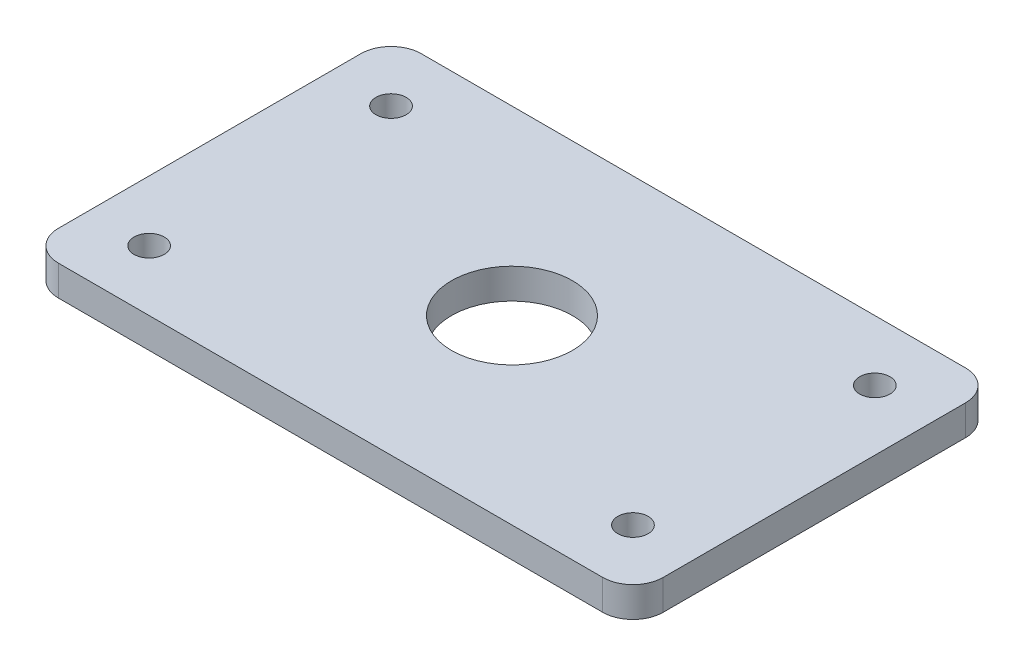
ISO-10303-21;
HEADER;
FILE_DESCRIPTION(('STEP AP214'),'2;1');
FILE_NAME('part.step','',(''),(''),'','','');
FILE_SCHEMA(('AUTOMOTIVE_DESIGN { 1 0 10303 214 1 1 1 1 }'));
ENDSEC;
DATA;
#1=APPLICATION_CONTEXT('core data for automotive mechanical design processes');
#2=APPLICATION_PROTOCOL_DEFINITION('international standard','automotive_design',2000,#1);
#3=PRODUCT_CONTEXT('',#1,'mechanical');
#4=PRODUCT('Part','Part','',(#3));
#5=PRODUCT_RELATED_PRODUCT_CATEGORY('part','',(#4));
#6=PRODUCT_DEFINITION_FORMATION('','',#4);
#7=PRODUCT_DEFINITION_CONTEXT('part definition',#1,'design');
#8=PRODUCT_DEFINITION('design','',#6,#7);
#9=PRODUCT_DEFINITION_SHAPE('','',#8);
#10=(LENGTH_UNIT() NAMED_UNIT(*) SI_UNIT(.MILLI.,.METRE.));
#11=(NAMED_UNIT(*) PLANE_ANGLE_UNIT() SI_UNIT($,.RADIAN.));
#12=(NAMED_UNIT(*) SI_UNIT($,.STERADIAN.) SOLID_ANGLE_UNIT());
#13=UNCERTAINTY_MEASURE_WITH_UNIT(LENGTH_MEASURE(1.E-05),#10,'distance_accuracy_value','');
#14=(GEOMETRIC_REPRESENTATION_CONTEXT(3) GLOBAL_UNCERTAINTY_ASSIGNED_CONTEXT((#13)) GLOBAL_UNIT_ASSIGNED_CONTEXT((#10,
#11,#12)) REPRESENTATION_CONTEXT('',''));
#15=CARTESIAN_POINT('',(0.,0.,0.));
#16=DIRECTION('',(0.,0.,1.));
#17=DIRECTION('',(1.,0.,0.));
#18=AXIS2_PLACEMENT_3D('',#15,#16,#17);
#19=CARTESIAN_POINT('',(-50.8,0.,25.4));
#20=DIRECTION('',(0.,1.,0.));
#21=DIRECTION('',(0.,0.,1.));
#22=AXIS2_PLACEMENT_3D('',#19,#20,#21);
#23=CYLINDRICAL_SURFACE('',#22,3.175);
#24=CARTESIAN_POINT('',(-50.8,0.,25.4));
#25=DIRECTION('',(0.,1.,0.));
#26=DIRECTION('',(0.,0.,1.));
#27=AXIS2_PLACEMENT_3D('',#24,#25,#26);
#28=CIRCLE('',#27,3.175);
#29=CARTESIAN_POINT('',(-50.8,0.,28.575));
#30=VERTEX_POINT('',#29);
#31=EDGE_CURVE('E148',#30,#30,#28,.T.);
#32=ORIENTED_EDGE('',*,*,#31,.F.);
#33=EDGE_LOOP('',(#32));
#34=FACE_BOUND('',#33,.T.);
#35=CARTESIAN_POINT('',(-50.8,6.35,25.4));
#36=DIRECTION('',(0.,1.,0.));
#37=DIRECTION('',(0.,0.,1.));
#38=AXIS2_PLACEMENT_3D('',#35,#36,#37);
#39=CIRCLE('',#38,3.175);
#40=CARTESIAN_POINT('',(-50.8,6.35,28.575));
#41=VERTEX_POINT('',#40);
#42=EDGE_CURVE('E153',#41,#41,#39,.T.);
#43=ORIENTED_EDGE('',*,*,#42,.T.);
#44=EDGE_LOOP('',(#43));
#45=FACE_BOUND('',#44,.T.);
#46=ADVANCED_FACE('F41',(#34,#45),#23,.F.);
#47=CARTESIAN_POINT('',(50.8,0.,25.4));
#48=DIRECTION('',(0.,1.,0.));
#49=DIRECTION('',(0.,0.,1.));
#50=AXIS2_PLACEMENT_3D('',#47,#48,#49);
#51=CYLINDRICAL_SURFACE('',#50,3.175);
#52=CARTESIAN_POINT('',(50.8,0.,25.4));
#53=DIRECTION('',(0.,1.,0.));
#54=DIRECTION('',(0.,0.,1.));
#55=AXIS2_PLACEMENT_3D('',#52,#53,#54);
#56=CIRCLE('',#55,3.175);
#57=CARTESIAN_POINT('',(50.8,0.,28.575));
#58=VERTEX_POINT('',#57);
#59=EDGE_CURVE('E141',#58,#58,#56,.T.);
#60=ORIENTED_EDGE('',*,*,#59,.F.);
#61=EDGE_LOOP('',(#60));
#62=FACE_BOUND('',#61,.T.);
#63=CARTESIAN_POINT('',(50.8,6.35,25.4));
#64=DIRECTION('',(0.,1.,0.));
#65=DIRECTION('',(0.,0.,1.));
#66=AXIS2_PLACEMENT_3D('',#63,#64,#65);
#67=CIRCLE('',#66,3.175);
#68=CARTESIAN_POINT('',(50.8,6.35,28.575));
#69=VERTEX_POINT('',#68);
#70=EDGE_CURVE('E147',#69,#69,#67,.T.);
#71=ORIENTED_EDGE('',*,*,#70,.T.);
#72=EDGE_LOOP('',(#71));
#73=FACE_BOUND('',#72,.T.);
#74=ADVANCED_FACE('F250',(#62,#73),#51,.F.);
#75=CARTESIAN_POINT('',(-63.5,6.35,38.1));
#76=DIRECTION('',(1.,0.,0.));
#77=DIRECTION('',(0.,0.,-1.));
#78=AXIS2_PLACEMENT_3D('',#75,#76,#77);
#79=PLANE('',#78);
#80=DIRECTION('',(0.,0.,1.));
#81=VECTOR('',#80,1.);
#82=CARTESIAN_POINT('',(-63.5,6.35,38.1));
#83=LINE('',#82,#81);
#84=CARTESIAN_POINT('',(-63.5,6.35,-31.75));
#85=VERTEX_POINT('',#84);
#86=CARTESIAN_POINT('',(-63.5,6.35,31.75));
#87=VERTEX_POINT('',#86);
#88=EDGE_CURVE('E136',#85,#87,#83,.T.);
#89=ORIENTED_EDGE('',*,*,#88,.F.);
#90=DIRECTION('',(0.,-1.,0.));
#91=VECTOR('',#90,1.);
#92=CARTESIAN_POINT('',(-63.5,6.35,-31.75));
#93=LINE('',#92,#91);
#94=CARTESIAN_POINT('',(-63.5,0.,-31.75));
#95=VERTEX_POINT('',#94);
#96=EDGE_CURVE('E11',#85,#95,#93,.T.);
#97=ORIENTED_EDGE('',*,*,#96,.T.);
#98=DIRECTION('',(0.,0.,1.));
#99=VECTOR('',#98,1.);
#100=CARTESIAN_POINT('',(-63.5,0.,38.1));
#101=LINE('',#100,#99);
#102=CARTESIAN_POINT('',(-63.5,0.,31.75));
#103=VERTEX_POINT('',#102);
#104=EDGE_CURVE('E138',#95,#103,#101,.T.);
#105=ORIENTED_EDGE('',*,*,#104,.T.);
#106=DIRECTION('',(0.,-1.,0.));
#107=VECTOR('',#106,1.);
#108=CARTESIAN_POINT('',(-63.5,6.35,31.75));
#109=LINE('',#108,#107);
#110=EDGE_CURVE('E47',#103,#87,#109,.F.);
#111=ORIENTED_EDGE('',*,*,#110,.T.);
#112=EDGE_LOOP('',(#89,#97,#105,#111));
#113=FACE_BOUND('',#112,.T.);
#114=ADVANCED_FACE('F177',(#113),#79,.F.);
#115=CARTESIAN_POINT('',(63.5,6.35,38.1));
#116=DIRECTION('',(0.,0.,-1.));
#117=DIRECTION('',(-1.,0.,0.));
#118=AXIS2_PLACEMENT_3D('',#115,#116,#117);
#119=PLANE('',#118);
#120=DIRECTION('',(1.,0.,0.));
#121=VECTOR('',#120,1.);
#122=CARTESIAN_POINT('',(63.5,0.,38.1));
#123=LINE('',#122,#121);
#124=CARTESIAN_POINT('',(-57.15,0.,38.1));
#125=VERTEX_POINT('',#124);
#126=CARTESIAN_POINT('',(57.15,0.,38.1));
#127=VERTEX_POINT('',#126);
#128=EDGE_CURVE('E134',#125,#127,#123,.T.);
#129=ORIENTED_EDGE('',*,*,#128,.T.);
#130=DIRECTION('',(0.,-1.,0.));
#131=VECTOR('',#130,1.);
#132=CARTESIAN_POINT('',(57.15,6.35,38.1));
#133=LINE('',#132,#131);
#134=CARTESIAN_POINT('',(57.15,6.35,38.1));
#135=VERTEX_POINT('',#134);
#136=EDGE_CURVE('E113',#127,#135,#133,.F.);
#137=ORIENTED_EDGE('',*,*,#136,.T.);
#138=DIRECTION('',(1.,0.,0.));
#139=VECTOR('',#138,1.);
#140=CARTESIAN_POINT('',(63.5,6.35,38.1));
#141=LINE('',#140,#139);
#142=CARTESIAN_POINT('',(-57.15,6.35,38.1));
#143=VERTEX_POINT('',#142);
#144=EDGE_CURVE('E186',#143,#135,#141,.T.);
#145=ORIENTED_EDGE('',*,*,#144,.F.);
#146=DIRECTION('',(0.,-1.,0.));
#147=VECTOR('',#146,1.);
#148=CARTESIAN_POINT('',(-57.15,6.35,38.1));
#149=LINE('',#148,#147);
#150=EDGE_CURVE('E117',#143,#125,#149,.T.);
#151=ORIENTED_EDGE('',*,*,#150,.T.);
#152=EDGE_LOOP('',(#129,#137,#145,#151));
#153=FACE_BOUND('',#152,.T.);
#154=ADVANCED_FACE('F194',(#153),#119,.F.);
#155=CARTESIAN_POINT('',(63.5,6.35,38.1));
#156=DIRECTION('',(-1.,0.,0.));
#157=DIRECTION('',(0.,0.,1.));
#158=AXIS2_PLACEMENT_3D('',#155,#156,#157);
#159=PLANE('',#158);
#160=DIRECTION('',(0.,0.,-1.));
#161=VECTOR('',#160,1.);
#162=CARTESIAN_POINT('',(63.5,6.35,38.1));
#163=LINE('',#162,#161);
#164=CARTESIAN_POINT('',(63.5,6.35,31.75));
#165=VERTEX_POINT('',#164);
#166=CARTESIAN_POINT('',(63.5,6.35,-31.75));
#167=VERTEX_POINT('',#166);
#168=EDGE_CURVE('E130',#165,#167,#163,.T.);
#169=ORIENTED_EDGE('',*,*,#168,.F.);
#170=DIRECTION('',(0.,-1.,0.));
#171=VECTOR('',#170,1.);
#172=CARTESIAN_POINT('',(63.5,6.35,31.75));
#173=LINE('',#172,#171);
#174=CARTESIAN_POINT('',(63.5,0.,31.75));
#175=VERTEX_POINT('',#174);
#176=EDGE_CURVE('E115',#165,#175,#173,.T.);
#177=ORIENTED_EDGE('',*,*,#176,.T.);
#178=DIRECTION('',(0.,0.,-1.));
#179=VECTOR('',#178,1.);
#180=CARTESIAN_POINT('',(63.5,0.,38.1));
#181=LINE('',#180,#179);
#182=CARTESIAN_POINT('',(63.5,0.,-31.75));
#183=VERTEX_POINT('',#182);
#184=EDGE_CURVE('E123',#175,#183,#181,.T.);
#185=ORIENTED_EDGE('',*,*,#184,.T.);
#186=DIRECTION('',(0.,-1.,0.));
#187=VECTOR('',#186,1.);
#188=CARTESIAN_POINT('',(63.5,6.35,-31.75));
#189=LINE('',#188,#187);
#190=EDGE_CURVE('E126',#183,#167,#189,.F.);
#191=ORIENTED_EDGE('',*,*,#190,.T.);
#192=EDGE_LOOP('',(#169,#177,#185,#191));
#193=FACE_BOUND('',#192,.T.);
#194=ADVANCED_FACE('F121',(#193),#159,.F.);
#195=CARTESIAN_POINT('',(63.5,6.35,-38.1));
#196=DIRECTION('',(0.,0.,1.));
#197=DIRECTION('',(1.,0.,0.));
#198=AXIS2_PLACEMENT_3D('',#195,#196,#197);
#199=PLANE('',#198);
#200=DIRECTION('',(-1.,0.,0.));
#201=VECTOR('',#200,1.);
#202=CARTESIAN_POINT('',(63.5,6.35,-38.1));
#203=LINE('',#202,#201);
#204=CARTESIAN_POINT('',(57.15,6.35,-38.1));
#205=VERTEX_POINT('',#204);
#206=CARTESIAN_POINT('',(-57.15,6.35,-38.1));
#207=VERTEX_POINT('',#206);
#208=EDGE_CURVE('E150',#205,#207,#203,.T.);
#209=ORIENTED_EDGE('',*,*,#208,.F.);
#210=DIRECTION('',(0.,-1.,0.));
#211=VECTOR('',#210,1.);
#212=CARTESIAN_POINT('',(57.15,6.35,-38.1));
#213=LINE('',#212,#211);
#214=CARTESIAN_POINT('',(57.15,0.,-38.1));
#215=VERTEX_POINT('',#214);
#216=EDGE_CURVE('E175',#205,#215,#213,.T.);
#217=ORIENTED_EDGE('',*,*,#216,.T.);
#218=DIRECTION('',(-1.,0.,0.));
#219=VECTOR('',#218,1.);
#220=CARTESIAN_POINT('',(63.5,0.,-38.1));
#221=LINE('',#220,#219);
#222=CARTESIAN_POINT('',(-57.15,0.,-38.1));
#223=VERTEX_POINT('',#222);
#224=EDGE_CURVE('E132',#215,#223,#221,.T.);
#225=ORIENTED_EDGE('',*,*,#224,.T.);
#226=DIRECTION('',(0.,-1.,0.));
#227=VECTOR('',#226,1.);
#228=CARTESIAN_POINT('',(-57.15,6.35,-38.1));
#229=LINE('',#228,#227);
#230=EDGE_CURVE('E57',#223,#207,#229,.F.);
#231=ORIENTED_EDGE('',*,*,#230,.T.);
#232=EDGE_LOOP('',(#209,#217,#225,#231));
#233=FACE_BOUND('',#232,.T.);
#234=ADVANCED_FACE('F226',(#233),#199,.F.);
#235=CARTESIAN_POINT('',(0.,6.35,0.));
#236=DIRECTION('',(0.,1.,0.));
#237=DIRECTION('',(0.,0.,1.));
#238=AXIS2_PLACEMENT_3D('',#235,#236,#237);
#239=PLANE('',#238);
#240=CARTESIAN_POINT('',(0.,6.35,0.));
#241=DIRECTION('',(0.,1.,0.));
#242=DIRECTION('',(0.,0.,1.));
#243=AXIS2_PLACEMENT_3D('',#240,#241,#242);
#244=CIRCLE('',#243,12.7);
#245=CARTESIAN_POINT('',(0.,6.35,12.7));
#246=VERTEX_POINT('',#245);
#247=EDGE_CURVE('E212',#246,#246,#244,.T.);
#248=ORIENTED_EDGE('',*,*,#247,.F.);
#249=EDGE_LOOP('',(#248));
#250=FACE_BOUND('',#249,.T.);
#251=CARTESIAN_POINT('',(-50.8,6.35,-25.4));
#252=DIRECTION('',(0.,1.,0.));
#253=DIRECTION('',(0.,0.,1.));
#254=AXIS2_PLACEMENT_3D('',#251,#252,#253);
#255=CIRCLE('',#254,3.175);
#256=CARTESIAN_POINT('',(-50.8,6.35,-22.225));
#257=VERTEX_POINT('',#256);
#258=EDGE_CURVE('E205',#257,#257,#255,.T.);
#259=ORIENTED_EDGE('',*,*,#258,.F.);
#260=EDGE_LOOP('',(#259));
#261=FACE_BOUND('',#260,.T.);
#262=CARTESIAN_POINT('',(50.8,6.35,-25.4));
#263=DIRECTION('',(0.,1.,0.));
#264=DIRECTION('',(0.,0.,1.));
#265=AXIS2_PLACEMENT_3D('',#262,#263,#264);
#266=CIRCLE('',#265,3.175);
#267=CARTESIAN_POINT('',(50.8,6.35,-22.225));
#268=VERTEX_POINT('',#267);
#269=EDGE_CURVE('E196',#268,#268,#266,.T.);
#270=ORIENTED_EDGE('',*,*,#269,.F.);
#271=EDGE_LOOP('',(#270));
#272=FACE_BOUND('',#271,.T.);
#273=ORIENTED_EDGE('',*,*,#144,.T.);
#274=CARTESIAN_POINT('',(57.15,6.35,31.75));
#275=DIRECTION('',(0.,1.,0.));
#276=DIRECTION('',(0.,0.,1.));
#277=AXIS2_PLACEMENT_3D('',#274,#275,#276);
#278=CIRCLE('',#277,6.35);
#279=EDGE_CURVE('E169',#135,#165,#278,.T.);
#280=ORIENTED_EDGE('',*,*,#279,.T.);
#281=ORIENTED_EDGE('',*,*,#168,.T.);
#282=CARTESIAN_POINT('',(57.15,6.35,-31.75));
#283=DIRECTION('',(0.,1.,0.));
#284=DIRECTION('',(0.,0.,1.));
#285=AXIS2_PLACEMENT_3D('',#282,#283,#284);
#286=CIRCLE('',#285,6.35);
#287=EDGE_CURVE('E64',#167,#205,#286,.T.);
#288=ORIENTED_EDGE('',*,*,#287,.T.);
#289=ORIENTED_EDGE('',*,*,#208,.T.);
#290=CARTESIAN_POINT('',(-57.15,6.35,-31.75));
#291=DIRECTION('',(0.,1.,0.));
#292=DIRECTION('',(0.,0.,1.));
#293=AXIS2_PLACEMENT_3D('',#290,#291,#292);
#294=CIRCLE('',#293,6.35);
#295=EDGE_CURVE('E168',#207,#85,#294,.T.);
#296=ORIENTED_EDGE('',*,*,#295,.T.);
#297=ORIENTED_EDGE('',*,*,#88,.T.);
#298=CARTESIAN_POINT('',(-57.15,6.35,31.75));
#299=DIRECTION('',(0.,1.,0.));
#300=DIRECTION('',(0.,0.,1.));
#301=AXIS2_PLACEMENT_3D('',#298,#299,#300);
#302=CIRCLE('',#301,6.35);
#303=EDGE_CURVE('E165',#87,#143,#302,.T.);
#304=ORIENTED_EDGE('',*,*,#303,.T.);
#305=EDGE_LOOP('',(#273,#280,#281,#288,#289,#296,#297,#304));
#306=FACE_BOUND('',#305,.T.);
#307=ORIENTED_EDGE('',*,*,#70,.F.);
#308=EDGE_LOOP('',(#307));
#309=FACE_BOUND('',#308,.T.);
#310=ORIENTED_EDGE('',*,*,#42,.F.);
#311=EDGE_LOOP('',(#310));
#312=FACE_BOUND('',#311,.T.);
#313=ADVANCED_FACE('F184',(#250,#261,#272,#306,#309,#312),#239,.T.);
#314=CARTESIAN_POINT('',(0.,0.,0.));
#315=DIRECTION('',(0.,1.,0.));
#316=DIRECTION('',(0.,0.,1.));
#317=AXIS2_PLACEMENT_3D('',#314,#315,#316);
#318=PLANE('',#317);
#319=CARTESIAN_POINT('',(0.,0.,0.));
#320=DIRECTION('',(0.,1.,0.));
#321=DIRECTION('',(0.,0.,1.));
#322=AXIS2_PLACEMENT_3D('',#319,#320,#321);
#323=CIRCLE('',#322,12.7);
#324=CARTESIAN_POINT('',(0.,0.,12.7));
#325=VERTEX_POINT('',#324);
#326=EDGE_CURVE('E208',#325,#325,#323,.T.);
#327=ORIENTED_EDGE('',*,*,#326,.T.);
#328=EDGE_LOOP('',(#327));
#329=FACE_BOUND('',#328,.T.);
#330=CARTESIAN_POINT('',(-50.8,0.,-25.4));
#331=DIRECTION('',(0.,1.,0.));
#332=DIRECTION('',(0.,0.,1.));
#333=AXIS2_PLACEMENT_3D('',#330,#331,#332);
#334=CIRCLE('',#333,3.175);
#335=CARTESIAN_POINT('',(-50.8,0.,-22.225));
#336=VERTEX_POINT('',#335);
#337=EDGE_CURVE('E210',#336,#336,#334,.T.);
#338=ORIENTED_EDGE('',*,*,#337,.T.);
#339=EDGE_LOOP('',(#338));
#340=FACE_BOUND('',#339,.T.);
#341=CARTESIAN_POINT('',(50.8,0.,-25.4));
#342=DIRECTION('',(0.,1.,0.));
#343=DIRECTION('',(0.,0.,1.));
#344=AXIS2_PLACEMENT_3D('',#341,#342,#343);
#345=CIRCLE('',#344,3.175);
#346=CARTESIAN_POINT('',(50.8,0.,-22.225));
#347=VERTEX_POINT('',#346);
#348=EDGE_CURVE('E191',#347,#347,#345,.T.);
#349=ORIENTED_EDGE('',*,*,#348,.T.);
#350=EDGE_LOOP('',(#349));
#351=FACE_BOUND('',#350,.T.);
#352=ORIENTED_EDGE('',*,*,#184,.F.);
#353=CARTESIAN_POINT('',(57.15,0.,31.75));
#354=DIRECTION('',(0.,1.,0.));
#355=DIRECTION('',(0.,0.,1.));
#356=AXIS2_PLACEMENT_3D('',#353,#354,#355);
#357=CIRCLE('',#356,6.35);
#358=EDGE_CURVE('E108',#175,#127,#357,.F.);
#359=ORIENTED_EDGE('',*,*,#358,.T.);
#360=ORIENTED_EDGE('',*,*,#128,.F.);
#361=CARTESIAN_POINT('',(-57.15,0.,31.75));
#362=DIRECTION('',(0.,1.,0.));
#363=DIRECTION('',(0.,0.,1.));
#364=AXIS2_PLACEMENT_3D('',#361,#362,#363);
#365=CIRCLE('',#364,6.35);
#366=EDGE_CURVE('E129',#125,#103,#365,.F.);
#367=ORIENTED_EDGE('',*,*,#366,.T.);
#368=ORIENTED_EDGE('',*,*,#104,.F.);
#369=CARTESIAN_POINT('',(-57.15,0.,-31.75));
#370=DIRECTION('',(0.,1.,0.));
#371=DIRECTION('',(0.,0.,1.));
#372=AXIS2_PLACEMENT_3D('',#369,#370,#371);
#373=CIRCLE('',#372,6.35);
#374=EDGE_CURVE('E160',#95,#223,#373,.F.);
#375=ORIENTED_EDGE('',*,*,#374,.T.);
#376=ORIENTED_EDGE('',*,*,#224,.F.);
#377=CARTESIAN_POINT('',(57.15,0.,-31.75));
#378=DIRECTION('',(0.,1.,0.));
#379=DIRECTION('',(0.,0.,1.));
#380=AXIS2_PLACEMENT_3D('',#377,#378,#379);
#381=CIRCLE('',#380,6.35);
#382=EDGE_CURVE('E118',#215,#183,#381,.F.);
#383=ORIENTED_EDGE('',*,*,#382,.T.);
#384=EDGE_LOOP('',(#352,#359,#360,#367,#368,#375,#376,#383));
#385=FACE_BOUND('',#384,.T.);
#386=ORIENTED_EDGE('',*,*,#59,.T.);
#387=EDGE_LOOP('',(#386));
#388=FACE_BOUND('',#387,.T.);
#389=ORIENTED_EDGE('',*,*,#31,.T.);
#390=EDGE_LOOP('',(#389));
#391=FACE_BOUND('',#390,.T.);
#392=ADVANCED_FACE('F131',(#329,#340,#351,#385,#388,#391),#318,.F.);
#393=CARTESIAN_POINT('',(50.8,0.,-25.4));
#394=DIRECTION('',(0.,1.,0.));
#395=DIRECTION('',(0.,0.,1.));
#396=AXIS2_PLACEMENT_3D('',#393,#394,#395);
#397=CYLINDRICAL_SURFACE('',#396,3.175);
#398=ORIENTED_EDGE('',*,*,#348,.F.);
#399=EDGE_LOOP('',(#398));
#400=FACE_BOUND('',#399,.T.);
#401=ORIENTED_EDGE('',*,*,#269,.T.);
#402=EDGE_LOOP('',(#401));
#403=FACE_BOUND('',#402,.T.);
#404=ADVANCED_FACE('F234',(#400,#403),#397,.F.);
#405=CARTESIAN_POINT('',(-50.8,0.,-25.4));
#406=DIRECTION('',(0.,1.,0.));
#407=DIRECTION('',(0.,0.,1.));
#408=AXIS2_PLACEMENT_3D('',#405,#406,#407);
#409=CYLINDRICAL_SURFACE('',#408,3.175);
#410=ORIENTED_EDGE('',*,*,#337,.F.);
#411=EDGE_LOOP('',(#410));
#412=FACE_BOUND('',#411,.T.);
#413=ORIENTED_EDGE('',*,*,#258,.T.);
#414=EDGE_LOOP('',(#413));
#415=FACE_BOUND('',#414,.T.);
#416=ADVANCED_FACE('F221',(#412,#415),#409,.F.);
#417=CARTESIAN_POINT('',(0.,0.,0.));
#418=DIRECTION('',(0.,1.,0.));
#419=DIRECTION('',(0.,0.,1.));
#420=AXIS2_PLACEMENT_3D('',#417,#418,#419);
#421=CYLINDRICAL_SURFACE('',#420,12.7);
#422=ORIENTED_EDGE('',*,*,#326,.F.);
#423=EDGE_LOOP('',(#422));
#424=FACE_BOUND('',#423,.T.);
#425=ORIENTED_EDGE('',*,*,#247,.T.);
#426=EDGE_LOOP('',(#425));
#427=FACE_BOUND('',#426,.T.);
#428=ADVANCED_FACE('F217',(#424,#427),#421,.F.);
#429=CARTESIAN_POINT('',(57.15,6.35,31.75));
#430=DIRECTION('',(0.,-1.,0.));
#431=DIRECTION('',(0.,0.,-1.));
#432=AXIS2_PLACEMENT_3D('',#429,#430,#431);
#433=CYLINDRICAL_SURFACE('',#432,6.35);
#434=ORIENTED_EDGE('',*,*,#279,.F.);
#435=ORIENTED_EDGE('',*,*,#136,.F.);
#436=ORIENTED_EDGE('',*,*,#358,.F.);
#437=ORIENTED_EDGE('',*,*,#176,.F.);
#438=EDGE_LOOP('',(#434,#435,#436,#437));
#439=FACE_BOUND('',#438,.T.);
#440=ADVANCED_FACE('F111',(#439),#433,.T.);
#441=CARTESIAN_POINT('',(57.15,6.35,-31.75));
#442=DIRECTION('',(0.,-1.,0.));
#443=DIRECTION('',(0.,0.,-1.));
#444=AXIS2_PLACEMENT_3D('',#441,#442,#443);
#445=CYLINDRICAL_SURFACE('',#444,6.35);
#446=ORIENTED_EDGE('',*,*,#287,.F.);
#447=ORIENTED_EDGE('',*,*,#190,.F.);
#448=ORIENTED_EDGE('',*,*,#382,.F.);
#449=ORIENTED_EDGE('',*,*,#216,.F.);
#450=EDGE_LOOP('',(#446,#447,#448,#449));
#451=FACE_BOUND('',#450,.T.);
#452=ADVANCED_FACE('F261',(#451),#445,.T.);
#453=CARTESIAN_POINT('',(-57.15,6.35,-31.75));
#454=DIRECTION('',(0.,-1.,0.));
#455=DIRECTION('',(0.,0.,-1.));
#456=AXIS2_PLACEMENT_3D('',#453,#454,#455);
#457=CYLINDRICAL_SURFACE('',#456,6.35);
#458=ORIENTED_EDGE('',*,*,#295,.F.);
#459=ORIENTED_EDGE('',*,*,#230,.F.);
#460=ORIENTED_EDGE('',*,*,#374,.F.);
#461=ORIENTED_EDGE('',*,*,#96,.F.);
#462=EDGE_LOOP('',(#458,#459,#460,#461));
#463=FACE_BOUND('',#462,.T.);
#464=ADVANCED_FACE('F263',(#463),#457,.T.);
#465=CARTESIAN_POINT('',(-57.15,6.35,31.75));
#466=DIRECTION('',(0.,-1.,0.));
#467=DIRECTION('',(0.,0.,-1.));
#468=AXIS2_PLACEMENT_3D('',#465,#466,#467);
#469=CYLINDRICAL_SURFACE('',#468,6.35);
#470=ORIENTED_EDGE('',*,*,#303,.F.);
#471=ORIENTED_EDGE('',*,*,#110,.F.);
#472=ORIENTED_EDGE('',*,*,#366,.F.);
#473=ORIENTED_EDGE('',*,*,#150,.F.);
#474=EDGE_LOOP('',(#470,#471,#472,#473));
#475=FACE_BOUND('',#474,.T.);
#476=ADVANCED_FACE('F43',(#475),#469,.T.);
#477=CLOSED_SHELL('',(#46,#74,#114,#154,#194,#234,#313,#392,#404,#416,#428,#440,#452,#464,#476));
#478=MANIFOLD_SOLID_BREP('B2',#477);
#479=ADVANCED_BREP_SHAPE_REPRESENTATION('',(#18,#478),#14);
#480=SHAPE_DEFINITION_REPRESENTATION(#9,#479);
ENDSEC;
END-ISO-10303-21;
